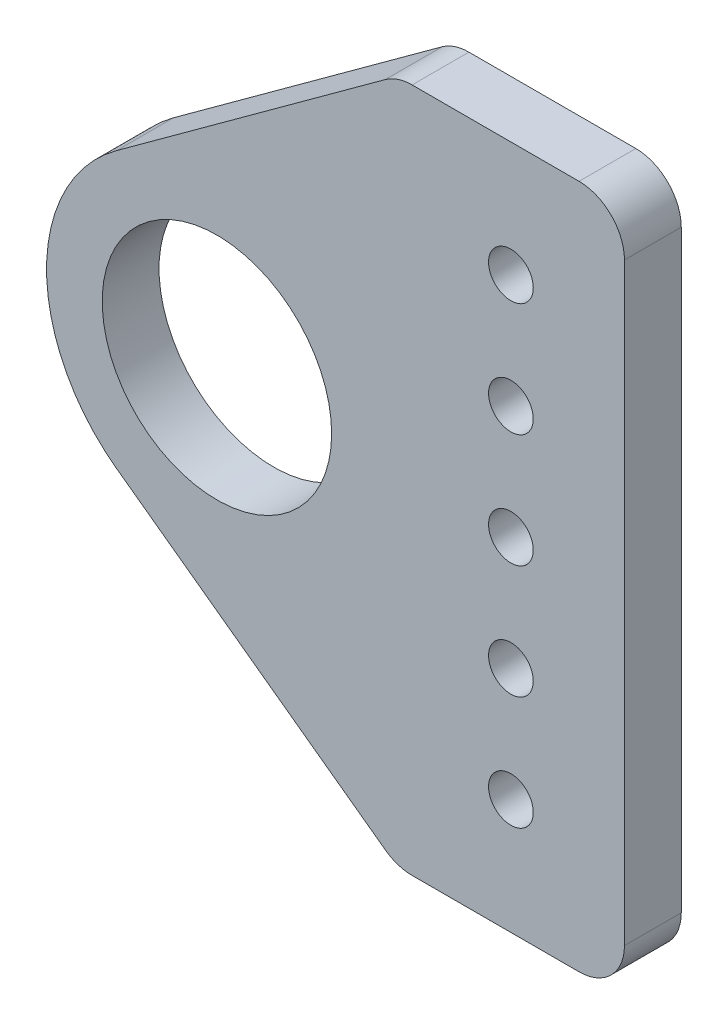
ISO-10303-21;
HEADER;
FILE_DESCRIPTION(('STEP AP214'),'2;1');
FILE_NAME('part.step','',(''),(''),'','','');
FILE_SCHEMA(('AUTOMOTIVE_DESIGN { 1 0 10303 214 1 1 1 1 }'));
ENDSEC;
DATA;
#1=APPLICATION_CONTEXT('core data for automotive mechanical design processes');
#2=APPLICATION_PROTOCOL_DEFINITION('international standard','automotive_design',2000,#1);
#3=PRODUCT_CONTEXT('',#1,'mechanical');
#4=PRODUCT('Part','Part','',(#3));
#5=PRODUCT_RELATED_PRODUCT_CATEGORY('part','',(#4));
#6=PRODUCT_DEFINITION_FORMATION('','',#4);
#7=PRODUCT_DEFINITION_CONTEXT('part definition',#1,'design');
#8=PRODUCT_DEFINITION('design','',#6,#7);
#9=PRODUCT_DEFINITION_SHAPE('','',#8);
#10=(LENGTH_UNIT() NAMED_UNIT(*) SI_UNIT(.MILLI.,.METRE.));
#11=(NAMED_UNIT(*) PLANE_ANGLE_UNIT() SI_UNIT($,.RADIAN.));
#12=(NAMED_UNIT(*) SI_UNIT($,.STERADIAN.) SOLID_ANGLE_UNIT());
#13=UNCERTAINTY_MEASURE_WITH_UNIT(LENGTH_MEASURE(1.E-05),#10,'distance_accuracy_value','');
#14=(GEOMETRIC_REPRESENTATION_CONTEXT(3) GLOBAL_UNCERTAINTY_ASSIGNED_CONTEXT((#13)) GLOBAL_UNIT_ASSIGNED_CONTEXT((#10,
#11,#12)) REPRESENTATION_CONTEXT('',''));
#15=CARTESIAN_POINT('',(0.,0.,0.));
#16=DIRECTION('',(0.,0.,1.));
#17=DIRECTION('',(1.,0.,0.));
#18=AXIS2_PLACEMENT_3D('',#15,#16,#17);
#19=CARTESIAN_POINT('',(-32.8729246480075,914.4,6.35));
#20=DIRECTION('',(0.,0.,1.));
#21=DIRECTION('',(1.,0.,0.));
#22=AXIS2_PLACEMENT_3D('',#19,#20,#21);
#23=PLANE('',#22);
#24=CARTESIAN_POINT('',(3.96743364877394E-13,901.7,6.35));
#25=DIRECTION('',(0.,0.,1.));
#26=DIRECTION('',(1.,0.,0.));
#27=AXIS2_PLACEMENT_3D('',#24,#25,#26);
#28=CIRCLE('',#27,2.49999999999977);
#29=CARTESIAN_POINT('',(2.50000000000017,901.7,6.35));
#30=VERTEX_POINT('',#29);
#31=EDGE_CURVE('E230',#30,#30,#28,.T.);
#32=ORIENTED_EDGE('',*,*,#31,.F.);
#33=EDGE_LOOP('',(#32));
#34=FACE_BOUND('',#33,.T.);
#35=CARTESIAN_POINT('',(1.32247788292465E-13,927.1,6.35));
#36=DIRECTION('',(0.,0.,1.));
#37=DIRECTION('',(1.,0.,0.));
#38=AXIS2_PLACEMENT_3D('',#35,#36,#37);
#39=CIRCLE('',#38,2.49999999999977);
#40=CARTESIAN_POINT('',(2.49999999999991,927.1,6.35));
#41=VERTEX_POINT('',#40);
#42=EDGE_CURVE('E218',#41,#41,#39,.T.);
#43=ORIENTED_EDGE('',*,*,#42,.F.);
#44=EDGE_LOOP('',(#43));
#45=FACE_BOUND('',#44,.T.);
#46=CARTESIAN_POINT('',(-32.8729246480075,914.4,6.35));
#47=DIRECTION('',(0.,0.,1.));
#48=DIRECTION('',(1.,0.,0.));
#49=AXIS2_PLACEMENT_3D('',#46,#47,#48);
#50=CIRCLE('',#49,12.827);
#51=CARTESIAN_POINT('',(-20.0459246480075,914.4,6.35));
#52=VERTEX_POINT('',#51);
#53=EDGE_CURVE('E146',#52,#52,#50,.T.);
#54=ORIENTED_EDGE('',*,*,#53,.F.);
#55=EDGE_LOOP('',(#54));
#56=FACE_BOUND('',#55,.T.);
#57=CARTESIAN_POINT('',(-32.8729246480075,914.4,6.35));
#58=DIRECTION('',(0.,0.,1.));
#59=DIRECTION('',(1.,0.,0.));
#60=AXIS2_PLACEMENT_3D('',#57,#58,#59);
#61=CIRCLE('',#60,19.05);
#62=CARTESIAN_POINT('',(-44.0943739572319,929.794205903537,6.35));
#63=VERTEX_POINT('',#62);
#64=CARTESIAN_POINT('',(-44.094373957232,899.005794096463,6.35));
#65=VERTEX_POINT('',#64);
#66=EDGE_CURVE('E161',#63,#65,#61,.T.);
#67=ORIENTED_EDGE('',*,*,#66,.T.);
#68=DIRECTION('',(0.808094798085955,-0.589052457177134,0.));
#69=VECTOR('',#68,1.);
#70=CARTESIAN_POINT('',(-14.0373922390012,877.096063977684,6.35));
#71=LINE('',#70,#69);
#72=CARTESIAN_POINT('',(-14.0373922390012,877.096063977684,6.35));
#73=VERTEX_POINT('',#72);
#74=EDGE_CURVE('E99',#65,#73,#71,.T.);
#75=ORIENTED_EDGE('',*,*,#74,.T.);
#76=CARTESIAN_POINT('',(-11.0450057565413,881.201185551961,6.35));
#77=DIRECTION('',(0.,0.,1.));
#78=DIRECTION('',(1.,0.,0.));
#79=AXIS2_PLACEMENT_3D('',#76,#77,#78);
#80=CIRCLE('',#79,5.07999999999996);
#81=CARTESIAN_POINT('',(-11.0450057565413,876.121185551961,6.35));
#82=VERTEX_POINT('',#81);
#83=EDGE_CURVE('E182',#73,#82,#80,.T.);
#84=ORIENTED_EDGE('',*,*,#83,.T.);
#85=DIRECTION('',(1.,0.,0.));
#86=VECTOR('',#85,1.);
#87=CARTESIAN_POINT('',(7.61999999999996,876.121185551961,6.35));
#88=LINE('',#87,#86);
#89=CARTESIAN_POINT('',(7.61999999999996,876.121185551961,6.35));
#90=VERTEX_POINT('',#89);
#91=EDGE_CURVE('E201',#82,#90,#88,.T.);
#92=ORIENTED_EDGE('',*,*,#91,.T.);
#93=CARTESIAN_POINT('',(7.62,881.201185551961,6.35));
#94=DIRECTION('',(0.,0.,1.));
#95=DIRECTION('',(1.,0.,0.));
#96=AXIS2_PLACEMENT_3D('',#93,#94,#95);
#97=CIRCLE('',#96,5.07999999999999);
#98=CARTESIAN_POINT('',(12.7,881.201185551961,6.35));
#99=VERTEX_POINT('',#98);
#100=EDGE_CURVE('E198',#90,#99,#97,.T.);
#101=ORIENTED_EDGE('',*,*,#100,.T.);
#102=DIRECTION('',(0.,1.,0.));
#103=VECTOR('',#102,1.);
#104=CARTESIAN_POINT('',(12.7,881.201185551961,6.35));
#105=LINE('',#104,#103);
#106=CARTESIAN_POINT('',(12.7,947.598814448039,6.35));
#107=VERTEX_POINT('',#106);
#108=EDGE_CURVE('E200',#99,#107,#105,.T.);
#109=ORIENTED_EDGE('',*,*,#108,.T.);
#110=CARTESIAN_POINT('',(7.62,947.598814448039,6.35));
#111=DIRECTION('',(0.,0.,1.));
#112=DIRECTION('',(-1.,0.,0.));
#113=AXIS2_PLACEMENT_3D('',#110,#111,#112);
#114=CIRCLE('',#113,5.07999999999999);
#115=CARTESIAN_POINT('',(7.61999999999996,952.678814448039,6.35));
#116=VERTEX_POINT('',#115);
#117=EDGE_CURVE('E124',#107,#116,#114,.T.);
#118=ORIENTED_EDGE('',*,*,#117,.T.);
#119=DIRECTION('',(-1.,0.,0.));
#120=VECTOR('',#119,1.);
#121=CARTESIAN_POINT('',(7.61999999999996,952.678814448039,6.35));
#122=LINE('',#121,#120);
#123=CARTESIAN_POINT('',(-11.0450057565413,952.678814448039,6.35));
#124=VERTEX_POINT('',#123);
#125=EDGE_CURVE('E118',#116,#124,#122,.T.);
#126=ORIENTED_EDGE('',*,*,#125,.T.);
#127=CARTESIAN_POINT('',(-11.0450057565413,947.598814448039,6.35));
#128=DIRECTION('',(0.,0.,1.));
#129=DIRECTION('',(1.,0.,0.));
#130=AXIS2_PLACEMENT_3D('',#127,#128,#129);
#131=CIRCLE('',#130,5.07999999999996);
#132=CARTESIAN_POINT('',(-14.0373922390012,951.703936022316,6.35));
#133=VERTEX_POINT('',#132);
#134=EDGE_CURVE('E122',#124,#133,#131,.T.);
#135=ORIENTED_EDGE('',*,*,#134,.T.);
#136=DIRECTION('',(-0.808094798085952,-0.589052457177138,0.));
#137=VECTOR('',#136,1.);
#138=CARTESIAN_POINT('',(-14.0373922390012,951.703936022316,6.35));
#139=LINE('',#138,#137);
#140=EDGE_CURVE('E50',#133,#63,#139,.T.);
#141=ORIENTED_EDGE('',*,*,#140,.T.);
#142=EDGE_LOOP('',(#67,#75,#84,#92,#101,#109,#118,#126,#135,#141));
#143=FACE_BOUND('',#142,.T.);
#144=CARTESIAN_POINT('',(0.,939.8,6.35));
#145=DIRECTION('',(0.,0.,1.));
#146=DIRECTION('',(1.,0.,0.));
#147=AXIS2_PLACEMENT_3D('',#144,#145,#146);
#148=CIRCLE('',#147,2.49999999999977);
#149=CARTESIAN_POINT('',(2.49999999999977,939.8,6.35));
#150=VERTEX_POINT('',#149);
#151=EDGE_CURVE('E212',#150,#150,#148,.T.);
#152=ORIENTED_EDGE('',*,*,#151,.F.);
#153=EDGE_LOOP('',(#152));
#154=FACE_BOUND('',#153,.T.);
#155=CARTESIAN_POINT('',(2.6449557658493E-13,914.4,6.35));
#156=DIRECTION('',(0.,0.,1.));
#157=DIRECTION('',(1.,0.,0.));
#158=AXIS2_PLACEMENT_3D('',#155,#156,#157);
#159=CIRCLE('',#158,2.49999999999977);
#160=CARTESIAN_POINT('',(2.50000000000004,914.4,6.35));
#161=VERTEX_POINT('',#160);
#162=EDGE_CURVE('E224',#161,#161,#159,.T.);
#163=ORIENTED_EDGE('',*,*,#162,.F.);
#164=EDGE_LOOP('',(#163));
#165=FACE_BOUND('',#164,.T.);
#166=CARTESIAN_POINT('',(5.28991153169859E-13,889.,6.35));
#167=DIRECTION('',(0.,0.,1.));
#168=DIRECTION('',(1.,0.,0.));
#169=AXIS2_PLACEMENT_3D('',#166,#167,#168);
#170=CIRCLE('',#169,2.49999999999977);
#171=CARTESIAN_POINT('',(2.5000000000003,889.,6.35));
#172=VERTEX_POINT('',#171);
#173=EDGE_CURVE('E236',#172,#172,#170,.T.);
#174=ORIENTED_EDGE('',*,*,#173,.F.);
#175=EDGE_LOOP('',(#174));
#176=FACE_BOUND('',#175,.T.);
#177=ADVANCED_FACE('F33',(#34,#45,#56,#143,#154,#165,#176),#23,.T.);
#178=CARTESIAN_POINT('',(-32.8729246480075,914.4,0.));
#179=DIRECTION('',(0.,0.,1.));
#180=DIRECTION('',(1.,0.,0.));
#181=AXIS2_PLACEMENT_3D('',#178,#179,#180);
#182=PLANE('',#181);
#183=CARTESIAN_POINT('',(-32.8729246480075,914.4,0.));
#184=DIRECTION('',(0.,0.,1.));
#185=DIRECTION('',(1.,0.,0.));
#186=AXIS2_PLACEMENT_3D('',#183,#184,#185);
#187=CIRCLE('',#186,19.05);
#188=CARTESIAN_POINT('',(-44.0943739572319,929.794205903537,0.));
#189=VERTEX_POINT('',#188);
#190=CARTESIAN_POINT('',(-44.094373957232,899.005794096463,0.));
#191=VERTEX_POINT('',#190);
#192=EDGE_CURVE('E142',#189,#191,#187,.T.);
#193=ORIENTED_EDGE('',*,*,#192,.F.);
#194=DIRECTION('',(-0.808094798085952,-0.589052457177138,0.));
#195=VECTOR('',#194,1.);
#196=CARTESIAN_POINT('',(-14.0373922390012,951.703936022316,0.));
#197=LINE('',#196,#195);
#198=CARTESIAN_POINT('',(-14.0373922390012,951.703936022316,0.));
#199=VERTEX_POINT('',#198);
#200=EDGE_CURVE('E91',#199,#189,#197,.T.);
#201=ORIENTED_EDGE('',*,*,#200,.F.);
#202=CARTESIAN_POINT('',(-11.0450057565413,947.598814448039,0.));
#203=DIRECTION('',(0.,0.,1.));
#204=DIRECTION('',(1.,0.,0.));
#205=AXIS2_PLACEMENT_3D('',#202,#203,#204);
#206=CIRCLE('',#205,5.07999999999996);
#207=CARTESIAN_POINT('',(-11.0450057565413,952.678814448039,0.));
#208=VERTEX_POINT('',#207);
#209=EDGE_CURVE('E85',#208,#199,#206,.T.);
#210=ORIENTED_EDGE('',*,*,#209,.F.);
#211=DIRECTION('',(-1.,0.,0.));
#212=VECTOR('',#211,1.);
#213=CARTESIAN_POINT('',(7.61999999999996,952.678814448039,0.));
#214=LINE('',#213,#212);
#215=CARTESIAN_POINT('',(7.61999999999996,952.678814448039,0.));
#216=VERTEX_POINT('',#215);
#217=EDGE_CURVE('E132',#216,#208,#214,.T.);
#218=ORIENTED_EDGE('',*,*,#217,.F.);
#219=CARTESIAN_POINT('',(7.62,947.598814448039,0.));
#220=DIRECTION('',(0.,0.,1.));
#221=DIRECTION('',(-1.,0.,0.));
#222=AXIS2_PLACEMENT_3D('',#219,#220,#221);
#223=CIRCLE('',#222,5.07999999999999);
#224=CARTESIAN_POINT('',(12.7,947.598814448039,0.));
#225=VERTEX_POINT('',#224);
#226=EDGE_CURVE('E156',#225,#216,#223,.T.);
#227=ORIENTED_EDGE('',*,*,#226,.F.);
#228=DIRECTION('',(0.,1.,0.));
#229=VECTOR('',#228,1.);
#230=CARTESIAN_POINT('',(12.7,881.201185551961,0.));
#231=LINE('',#230,#229);
#232=CARTESIAN_POINT('',(12.7,881.201185551961,0.));
#233=VERTEX_POINT('',#232);
#234=EDGE_CURVE('E154',#233,#225,#231,.T.);
#235=ORIENTED_EDGE('',*,*,#234,.F.);
#236=CARTESIAN_POINT('',(7.62,881.201185551961,0.));
#237=DIRECTION('',(0.,0.,1.));
#238=DIRECTION('',(1.,0.,0.));
#239=AXIS2_PLACEMENT_3D('',#236,#237,#238);
#240=CIRCLE('',#239,5.07999999999999);
#241=CARTESIAN_POINT('',(7.61999999999996,876.121185551961,0.));
#242=VERTEX_POINT('',#241);
#243=EDGE_CURVE('E152',#242,#233,#240,.T.);
#244=ORIENTED_EDGE('',*,*,#243,.F.);
#245=DIRECTION('',(1.,0.,0.));
#246=VECTOR('',#245,1.);
#247=CARTESIAN_POINT('',(7.61999999999996,876.121185551961,0.));
#248=LINE('',#247,#246);
#249=CARTESIAN_POINT('',(-11.0450057565413,876.121185551961,0.));
#250=VERTEX_POINT('',#249);
#251=EDGE_CURVE('E150',#250,#242,#248,.T.);
#252=ORIENTED_EDGE('',*,*,#251,.F.);
#253=CARTESIAN_POINT('',(-11.0450057565413,881.201185551961,0.));
#254=DIRECTION('',(0.,0.,1.));
#255=DIRECTION('',(1.,0.,0.));
#256=AXIS2_PLACEMENT_3D('',#253,#254,#255);
#257=CIRCLE('',#256,5.07999999999996);
#258=CARTESIAN_POINT('',(-14.0373922390012,877.096063977684,0.));
#259=VERTEX_POINT('',#258);
#260=EDGE_CURVE('E148',#259,#250,#257,.T.);
#261=ORIENTED_EDGE('',*,*,#260,.F.);
#262=DIRECTION('',(0.808094798085955,-0.589052457177134,0.));
#263=VECTOR('',#262,1.);
#264=CARTESIAN_POINT('',(-14.0373922390012,877.096063977684,0.));
#265=LINE('',#264,#263);
#266=EDGE_CURVE('E145',#191,#259,#265,.T.);
#267=ORIENTED_EDGE('',*,*,#266,.F.);
#268=EDGE_LOOP('',(#193,#201,#210,#218,#227,#235,#244,#252,#261,#267));
#269=FACE_BOUND('',#268,.T.);
#270=CARTESIAN_POINT('',(-32.8729246480075,914.4,0.));
#271=DIRECTION('',(0.,0.,1.));
#272=DIRECTION('',(1.,0.,0.));
#273=AXIS2_PLACEMENT_3D('',#270,#271,#272);
#274=CIRCLE('',#273,12.827);
#275=CARTESIAN_POINT('',(-20.0459246480075,914.4,0.));
#276=VERTEX_POINT('',#275);
#277=EDGE_CURVE('E209',#276,#276,#274,.T.);
#278=ORIENTED_EDGE('',*,*,#277,.T.);
#279=EDGE_LOOP('',(#278));
#280=FACE_BOUND('',#279,.T.);
#281=CARTESIAN_POINT('',(0.,939.8,0.));
#282=DIRECTION('',(0.,0.,1.));
#283=DIRECTION('',(1.,0.,0.));
#284=AXIS2_PLACEMENT_3D('',#281,#282,#283);
#285=CIRCLE('',#284,2.49999999999977);
#286=CARTESIAN_POINT('',(2.49999999999977,939.8,0.));
#287=VERTEX_POINT('',#286);
#288=EDGE_CURVE('E215',#287,#287,#285,.T.);
#289=ORIENTED_EDGE('',*,*,#288,.T.);
#290=EDGE_LOOP('',(#289));
#291=FACE_BOUND('',#290,.T.);
#292=CARTESIAN_POINT('',(1.32247788292465E-13,927.1,0.));
#293=DIRECTION('',(0.,0.,1.));
#294=DIRECTION('',(1.,0.,0.));
#295=AXIS2_PLACEMENT_3D('',#292,#293,#294);
#296=CIRCLE('',#295,2.49999999999977);
#297=CARTESIAN_POINT('',(2.49999999999991,927.1,0.));
#298=VERTEX_POINT('',#297);
#299=EDGE_CURVE('E221',#298,#298,#296,.T.);
#300=ORIENTED_EDGE('',*,*,#299,.T.);
#301=EDGE_LOOP('',(#300));
#302=FACE_BOUND('',#301,.T.);
#303=CARTESIAN_POINT('',(2.6449557658493E-13,914.4,0.));
#304=DIRECTION('',(0.,0.,1.));
#305=DIRECTION('',(1.,0.,0.));
#306=AXIS2_PLACEMENT_3D('',#303,#304,#305);
#307=CIRCLE('',#306,2.49999999999977);
#308=CARTESIAN_POINT('',(2.50000000000004,914.4,0.));
#309=VERTEX_POINT('',#308);
#310=EDGE_CURVE('E227',#309,#309,#307,.T.);
#311=ORIENTED_EDGE('',*,*,#310,.T.);
#312=EDGE_LOOP('',(#311));
#313=FACE_BOUND('',#312,.T.);
#314=CARTESIAN_POINT('',(3.96743364877394E-13,901.7,0.));
#315=DIRECTION('',(0.,0.,1.));
#316=DIRECTION('',(1.,0.,0.));
#317=AXIS2_PLACEMENT_3D('',#314,#315,#316);
#318=CIRCLE('',#317,2.49999999999977);
#319=CARTESIAN_POINT('',(2.50000000000017,901.7,0.));
#320=VERTEX_POINT('',#319);
#321=EDGE_CURVE('E233',#320,#320,#318,.T.);
#322=ORIENTED_EDGE('',*,*,#321,.T.);
#323=EDGE_LOOP('',(#322));
#324=FACE_BOUND('',#323,.T.);
#325=CARTESIAN_POINT('',(5.28991153169859E-13,889.,0.));
#326=DIRECTION('',(0.,0.,1.));
#327=DIRECTION('',(1.,0.,0.));
#328=AXIS2_PLACEMENT_3D('',#325,#326,#327);
#329=CIRCLE('',#328,2.49999999999977);
#330=CARTESIAN_POINT('',(2.5000000000003,889.,0.));
#331=VERTEX_POINT('',#330);
#332=EDGE_CURVE('E239',#331,#331,#329,.T.);
#333=ORIENTED_EDGE('',*,*,#332,.T.);
#334=EDGE_LOOP('',(#333));
#335=FACE_BOUND('',#334,.T.);
#336=ADVANCED_FACE('F186',(#269,#280,#291,#302,#313,#324,#335),#182,.F.);
#337=CARTESIAN_POINT('',(-32.8729246480075,914.4,6.35));
#338=DIRECTION('',(0.,0.,-1.));
#339=DIRECTION('',(-1.,0.,0.));
#340=AXIS2_PLACEMENT_3D('',#337,#338,#339);
#341=CYLINDRICAL_SURFACE('',#340,19.05);
#342=ORIENTED_EDGE('',*,*,#192,.T.);
#343=DIRECTION('',(0.,0.,-1.));
#344=VECTOR('',#343,1.);
#345=CARTESIAN_POINT('',(-44.094373957232,899.005794096463,6.35));
#346=LINE('',#345,#344);
#347=EDGE_CURVE('E11',#65,#191,#346,.T.);
#348=ORIENTED_EDGE('',*,*,#347,.F.);
#349=ORIENTED_EDGE('',*,*,#66,.F.);
#350=DIRECTION('',(0.,0.,-1.));
#351=VECTOR('',#350,1.);
#352=CARTESIAN_POINT('',(-44.0943739572319,929.794205903537,6.35));
#353=LINE('',#352,#351);
#354=EDGE_CURVE('E138',#63,#189,#353,.T.);
#355=ORIENTED_EDGE('',*,*,#354,.T.);
#356=EDGE_LOOP('',(#342,#348,#349,#355));
#357=FACE_BOUND('',#356,.T.);
#358=ADVANCED_FACE('F35',(#357),#341,.T.);
#359=CARTESIAN_POINT('',(-14.0373922390012,877.096063977684,6.35));
#360=DIRECTION('',(0.589052457177135,0.808094798085955,0.));
#361=DIRECTION('',(-0.808094798085955,0.589052457177135,0.));
#362=AXIS2_PLACEMENT_3D('',#359,#360,#361);
#363=PLANE('',#362);
#364=ORIENTED_EDGE('',*,*,#266,.T.);
#365=DIRECTION('',(0.,0.,-1.));
#366=VECTOR('',#365,1.);
#367=CARTESIAN_POINT('',(-14.0373922390012,877.096063977684,6.35));
#368=LINE('',#367,#366);
#369=EDGE_CURVE('E42',#73,#259,#368,.T.);
#370=ORIENTED_EDGE('',*,*,#369,.F.);
#371=ORIENTED_EDGE('',*,*,#74,.F.);
#372=ORIENTED_EDGE('',*,*,#347,.T.);
#373=EDGE_LOOP('',(#364,#370,#371,#372));
#374=FACE_BOUND('',#373,.T.);
#375=ADVANCED_FACE('F281',(#374),#363,.F.);
#376=CARTESIAN_POINT('',(-11.0450057565413,881.201185551961,6.35));
#377=DIRECTION('',(0.,0.,-1.));
#378=DIRECTION('',(-1.,0.,0.));
#379=AXIS2_PLACEMENT_3D('',#376,#377,#378);
#380=CYLINDRICAL_SURFACE('',#379,5.07999999999996);
#381=ORIENTED_EDGE('',*,*,#260,.T.);
#382=DIRECTION('',(0.,0.,-1.));
#383=VECTOR('',#382,1.);
#384=CARTESIAN_POINT('',(-11.0450057565413,876.121185551961,6.35));
#385=LINE('',#384,#383);
#386=EDGE_CURVE('E174',#82,#250,#385,.T.);
#387=ORIENTED_EDGE('',*,*,#386,.F.);
#388=ORIENTED_EDGE('',*,*,#83,.F.);
#389=ORIENTED_EDGE('',*,*,#369,.T.);
#390=EDGE_LOOP('',(#381,#387,#388,#389));
#391=FACE_BOUND('',#390,.T.);
#392=ADVANCED_FACE('F180',(#391),#380,.T.);
#393=CARTESIAN_POINT('',(7.61999999999996,876.121185551961,6.35));
#394=DIRECTION('',(0.,1.,0.));
#395=DIRECTION('',(0.,0.,1.));
#396=AXIS2_PLACEMENT_3D('',#393,#394,#395);
#397=PLANE('',#396);
#398=ORIENTED_EDGE('',*,*,#251,.T.);
#399=DIRECTION('',(0.,0.,-1.));
#400=VECTOR('',#399,1.);
#401=CARTESIAN_POINT('',(7.61999999999996,876.121185551961,6.35));
#402=LINE('',#401,#400);
#403=EDGE_CURVE('E171',#90,#242,#402,.T.);
#404=ORIENTED_EDGE('',*,*,#403,.F.);
#405=ORIENTED_EDGE('',*,*,#91,.F.);
#406=ORIENTED_EDGE('',*,*,#386,.T.);
#407=EDGE_LOOP('',(#398,#404,#405,#406));
#408=FACE_BOUND('',#407,.T.);
#409=ADVANCED_FACE('F192',(#408),#397,.F.);
#410=CARTESIAN_POINT('',(7.62,881.201185551961,6.35));
#411=DIRECTION('',(0.,0.,-1.));
#412=DIRECTION('',(-1.,0.,0.));
#413=AXIS2_PLACEMENT_3D('',#410,#411,#412);
#414=CYLINDRICAL_SURFACE('',#413,5.07999999999999);
#415=ORIENTED_EDGE('',*,*,#243,.T.);
#416=DIRECTION('',(0.,0.,-1.));
#417=VECTOR('',#416,1.);
#418=CARTESIAN_POINT('',(12.7,881.201185551961,6.35));
#419=LINE('',#418,#417);
#420=EDGE_CURVE('E168',#99,#233,#419,.T.);
#421=ORIENTED_EDGE('',*,*,#420,.F.);
#422=ORIENTED_EDGE('',*,*,#100,.F.);
#423=ORIENTED_EDGE('',*,*,#403,.T.);
#424=EDGE_LOOP('',(#415,#421,#422,#423));
#425=FACE_BOUND('',#424,.T.);
#426=ADVANCED_FACE('F196',(#425),#414,.T.);
#427=CARTESIAN_POINT('',(12.7,881.201185551961,6.35));
#428=DIRECTION('',(-1.,0.,0.));
#429=DIRECTION('',(0.,0.,1.));
#430=AXIS2_PLACEMENT_3D('',#427,#428,#429);
#431=PLANE('',#430);
#432=ORIENTED_EDGE('',*,*,#234,.T.);
#433=DIRECTION('',(0.,0.,-1.));
#434=VECTOR('',#433,1.);
#435=CARTESIAN_POINT('',(12.7,947.598814448039,6.35));
#436=LINE('',#435,#434);
#437=EDGE_CURVE('E165',#107,#225,#436,.T.);
#438=ORIENTED_EDGE('',*,*,#437,.F.);
#439=ORIENTED_EDGE('',*,*,#108,.F.);
#440=ORIENTED_EDGE('',*,*,#420,.T.);
#441=EDGE_LOOP('',(#432,#438,#439,#440));
#442=FACE_BOUND('',#441,.T.);
#443=ADVANCED_FACE('F271',(#442),#431,.F.);
#444=CARTESIAN_POINT('',(7.62,947.598814448039,6.35));
#445=DIRECTION('',(0.,0.,-1.));
#446=DIRECTION('',(-1.,0.,0.));
#447=AXIS2_PLACEMENT_3D('',#444,#445,#446);
#448=CYLINDRICAL_SURFACE('',#447,5.07999999999999);
#449=ORIENTED_EDGE('',*,*,#226,.T.);
#450=DIRECTION('',(0.,0.,-1.));
#451=VECTOR('',#450,1.);
#452=CARTESIAN_POINT('',(7.61999999999996,952.678814448039,6.35));
#453=LINE('',#452,#451);
#454=EDGE_CURVE('E133',#116,#216,#453,.T.);
#455=ORIENTED_EDGE('',*,*,#454,.F.);
#456=ORIENTED_EDGE('',*,*,#117,.F.);
#457=ORIENTED_EDGE('',*,*,#437,.T.);
#458=EDGE_LOOP('',(#449,#455,#456,#457));
#459=FACE_BOUND('',#458,.T.);
#460=ADVANCED_FACE('F268',(#459),#448,.T.);
#461=CARTESIAN_POINT('',(7.61999999999996,952.678814448039,6.35));
#462=DIRECTION('',(0.,-1.,0.));
#463=DIRECTION('',(0.,0.,-1.));
#464=AXIS2_PLACEMENT_3D('',#461,#462,#463);
#465=PLANE('',#464);
#466=ORIENTED_EDGE('',*,*,#217,.T.);
#467=DIRECTION('',(0.,0.,-1.));
#468=VECTOR('',#467,1.);
#469=CARTESIAN_POINT('',(-11.0450057565413,952.678814448039,6.35));
#470=LINE('',#469,#468);
#471=EDGE_CURVE('E129',#124,#208,#470,.T.);
#472=ORIENTED_EDGE('',*,*,#471,.F.);
#473=ORIENTED_EDGE('',*,*,#125,.F.);
#474=ORIENTED_EDGE('',*,*,#454,.T.);
#475=EDGE_LOOP('',(#466,#472,#473,#474));
#476=FACE_BOUND('',#475,.T.);
#477=ADVANCED_FACE('F130',(#476),#465,.F.);
#478=CARTESIAN_POINT('',(-11.0450057565413,947.598814448039,6.35));
#479=DIRECTION('',(0.,0.,-1.));
#480=DIRECTION('',(-1.,0.,0.));
#481=AXIS2_PLACEMENT_3D('',#478,#479,#480);
#482=CYLINDRICAL_SURFACE('',#481,5.07999999999996);
#483=ORIENTED_EDGE('',*,*,#209,.T.);
#484=DIRECTION('',(0.,0.,-1.));
#485=VECTOR('',#484,1.);
#486=CARTESIAN_POINT('',(-14.0373922390012,951.703936022316,6.35));
#487=LINE('',#486,#485);
#488=EDGE_CURVE('E134',#133,#199,#487,.T.);
#489=ORIENTED_EDGE('',*,*,#488,.F.);
#490=ORIENTED_EDGE('',*,*,#134,.F.);
#491=ORIENTED_EDGE('',*,*,#471,.T.);
#492=EDGE_LOOP('',(#483,#489,#490,#491));
#493=FACE_BOUND('',#492,.T.);
#494=ADVANCED_FACE('F136',(#493),#482,.T.);
#495=CARTESIAN_POINT('',(-14.0373922390012,951.703936022316,6.35));
#496=DIRECTION('',(0.589052457177138,-0.808094798085952,0.));
#497=DIRECTION('',(0.808094798085952,0.589052457177138,0.));
#498=AXIS2_PLACEMENT_3D('',#495,#496,#497);
#499=PLANE('',#498);
#500=ORIENTED_EDGE('',*,*,#200,.T.);
#501=ORIENTED_EDGE('',*,*,#354,.F.);
#502=ORIENTED_EDGE('',*,*,#140,.F.);
#503=ORIENTED_EDGE('',*,*,#488,.T.);
#504=EDGE_LOOP('',(#500,#501,#502,#503));
#505=FACE_BOUND('',#504,.T.);
#506=ADVANCED_FACE('F261',(#505),#499,.F.);
#507=CARTESIAN_POINT('',(-32.8729246480075,914.4,6.35));
#508=DIRECTION('',(0.,0.,-1.));
#509=DIRECTION('',(-1.,0.,0.));
#510=AXIS2_PLACEMENT_3D('',#507,#508,#509);
#511=CYLINDRICAL_SURFACE('',#510,12.827);
#512=ORIENTED_EDGE('',*,*,#53,.T.);
#513=EDGE_LOOP('',(#512));
#514=FACE_BOUND('',#513,.T.);
#515=ORIENTED_EDGE('',*,*,#277,.F.);
#516=EDGE_LOOP('',(#515));
#517=FACE_BOUND('',#516,.T.);
#518=ADVANCED_FACE('F258',(#514,#517),#511,.F.);
#519=CARTESIAN_POINT('',(0.,939.8,6.35));
#520=DIRECTION('',(0.,0.,-1.));
#521=DIRECTION('',(-1.,0.,0.));
#522=AXIS2_PLACEMENT_3D('',#519,#520,#521);
#523=CYLINDRICAL_SURFACE('',#522,2.49999999999977);
#524=ORIENTED_EDGE('',*,*,#151,.T.);
#525=EDGE_LOOP('',(#524));
#526=FACE_BOUND('',#525,.T.);
#527=ORIENTED_EDGE('',*,*,#288,.F.);
#528=EDGE_LOOP('',(#527));
#529=FACE_BOUND('',#528,.T.);
#530=ADVANCED_FACE('F357',(#526,#529),#523,.F.);
#531=CARTESIAN_POINT('',(1.32247788292465E-13,927.1,6.35));
#532=DIRECTION('',(0.,0.,-1.));
#533=DIRECTION('',(-1.,0.,0.));
#534=AXIS2_PLACEMENT_3D('',#531,#532,#533);
#535=CYLINDRICAL_SURFACE('',#534,2.49999999999977);
#536=ORIENTED_EDGE('',*,*,#42,.T.);
#537=EDGE_LOOP('',(#536));
#538=FACE_BOUND('',#537,.T.);
#539=ORIENTED_EDGE('',*,*,#299,.F.);
#540=EDGE_LOOP('',(#539));
#541=FACE_BOUND('',#540,.T.);
#542=ADVANCED_FACE('F365',(#538,#541),#535,.F.);
#543=CARTESIAN_POINT('',(2.6449557658493E-13,914.4,6.35));
#544=DIRECTION('',(0.,0.,-1.));
#545=DIRECTION('',(-1.,0.,0.));
#546=AXIS2_PLACEMENT_3D('',#543,#544,#545);
#547=CYLINDRICAL_SURFACE('',#546,2.49999999999977);
#548=ORIENTED_EDGE('',*,*,#162,.T.);
#549=EDGE_LOOP('',(#548));
#550=FACE_BOUND('',#549,.T.);
#551=ORIENTED_EDGE('',*,*,#310,.F.);
#552=EDGE_LOOP('',(#551));
#553=FACE_BOUND('',#552,.T.);
#554=ADVANCED_FACE('F373',(#550,#553),#547,.F.);
#555=CARTESIAN_POINT('',(3.96743364877394E-13,901.7,6.35));
#556=DIRECTION('',(0.,0.,-1.));
#557=DIRECTION('',(-1.,0.,0.));
#558=AXIS2_PLACEMENT_3D('',#555,#556,#557);
#559=CYLINDRICAL_SURFACE('',#558,2.49999999999977);
#560=ORIENTED_EDGE('',*,*,#31,.T.);
#561=EDGE_LOOP('',(#560));
#562=FACE_BOUND('',#561,.T.);
#563=ORIENTED_EDGE('',*,*,#321,.F.);
#564=EDGE_LOOP('',(#563));
#565=FACE_BOUND('',#564,.T.);
#566=ADVANCED_FACE('F382',(#562,#565),#559,.F.);
#567=CARTESIAN_POINT('',(5.28991153169859E-13,889.,6.35));
#568=DIRECTION('',(0.,0.,-1.));
#569=DIRECTION('',(-1.,0.,0.));
#570=AXIS2_PLACEMENT_3D('',#567,#568,#569);
#571=CYLINDRICAL_SURFACE('',#570,2.49999999999977);
#572=ORIENTED_EDGE('',*,*,#173,.T.);
#573=EDGE_LOOP('',(#572));
#574=FACE_BOUND('',#573,.T.);
#575=ORIENTED_EDGE('',*,*,#332,.F.);
#576=EDGE_LOOP('',(#575));
#577=FACE_BOUND('',#576,.T.);
#578=ADVANCED_FACE('F245',(#574,#577),#571,.F.);
#579=CLOSED_SHELL('',(#177,#336,#358,#375,#392,#409,#426,#443,#460,#477,#494,#506,#518,#530,
#542,#554,#566,#578));
#580=MANIFOLD_SOLID_BREP('B2',#579);
#581=ADVANCED_BREP_SHAPE_REPRESENTATION('',(#18,#580),#14);
#582=SHAPE_DEFINITION_REPRESENTATION(#9,#581);
ENDSEC;
END-ISO-10303-21;
